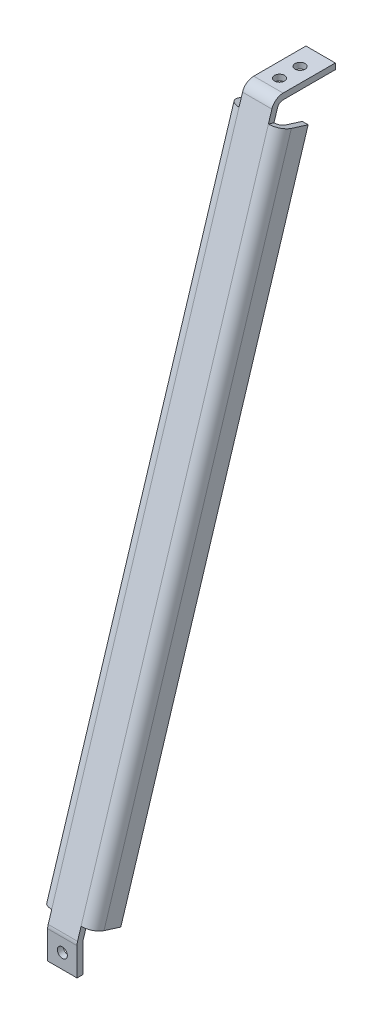
ISO-10303-21;
HEADER;
FILE_DESCRIPTION(('STEP AP214'),'2;1');
FILE_NAME('part.step','',(''),(''),'','','');
FILE_SCHEMA(('AUTOMOTIVE_DESIGN { 1 0 10303 214 1 1 1 1 }'));
ENDSEC;
DATA;
#1=APPLICATION_CONTEXT('core data for automotive mechanical design processes');
#2=APPLICATION_PROTOCOL_DEFINITION('international standard','automotive_design',2000,#1);
#3=PRODUCT_CONTEXT('',#1,'mechanical');
#4=PRODUCT('Part','Part','',(#3));
#5=PRODUCT_RELATED_PRODUCT_CATEGORY('part','',(#4));
#6=PRODUCT_DEFINITION_FORMATION('','',#4);
#7=PRODUCT_DEFINITION_CONTEXT('part definition',#1,'design');
#8=PRODUCT_DEFINITION('design','',#6,#7);
#9=PRODUCT_DEFINITION_SHAPE('','',#8);
#10=(LENGTH_UNIT() NAMED_UNIT(*) SI_UNIT(.MILLI.,.METRE.));
#11=(NAMED_UNIT(*) PLANE_ANGLE_UNIT() SI_UNIT($,.RADIAN.));
#12=(NAMED_UNIT(*) SI_UNIT($,.STERADIAN.) SOLID_ANGLE_UNIT());
#13=UNCERTAINTY_MEASURE_WITH_UNIT(LENGTH_MEASURE(1.E-05),#10,'distance_accuracy_value','');
#14=(GEOMETRIC_REPRESENTATION_CONTEXT(3) GLOBAL_UNCERTAINTY_ASSIGNED_CONTEXT((#13)) GLOBAL_UNIT_ASSIGNED_CONTEXT((#10,
#11,#12)) REPRESENTATION_CONTEXT('',''));
#15=CARTESIAN_POINT('',(0.,0.,0.));
#16=DIRECTION('',(0.,0.,1.));
#17=DIRECTION('',(1.,0.,0.));
#18=AXIS2_PLACEMENT_3D('',#15,#16,#17);
#19=CARTESIAN_POINT('',(195.,-68.,39.7925903591226));
#20=DIRECTION('',(1.,0.,0.));
#21=DIRECTION('',(0.,0.,-1.));
#22=AXIS2_PLACEMENT_3D('',#19,#20,#21);
#23=PLANE('',#22);
#24=DIRECTION('',(0.,-0.954716716288455,0.297516372052681));
#25=VECTOR('',#24,1.);
#26=CARTESIAN_POINT('',(195.,-66.8099345117893,43.6114572242764));
#27=LINE('',#26,#25);
#28=CARTESIAN_POINT('',(195.,-66.8099345117893,43.6114572242764));
#29=VERTEX_POINT('',#28);
#30=CARTESIAN_POINT('',(195.,-70.6288013769431,44.8015227124871));
#31=VERTEX_POINT('',#30);
#32=EDGE_CURVE('E283',#29,#31,#27,.T.);
#33=ORIENTED_EDGE('',*,*,#32,.T.);
#34=DIRECTION('',(0.,-0.297516372052681,-0.954716716288455));
#35=VECTOR('',#34,1.);
#36=CARTESIAN_POINT('',(195.,-71.8188668651538,40.9826558473333));
#37=LINE('',#36,#35);
#38=CARTESIAN_POINT('',(195.,-71.2238341210484,42.8920892799102));
#39=VERTEX_POINT('',#38);
#40=EDGE_CURVE('E49',#31,#39,#37,.T.);
#41=ORIENTED_EDGE('',*,*,#40,.T.);
#42=DIRECTION('',(0.,0.954716716288455,-0.297516372052681));
#43=VECTOR('',#42,1.);
#44=CARTESIAN_POINT('',(195.,-279.861580282591,107.909433432577));
#45=LINE('',#44,#43);
#46=CARTESIAN_POINT('',(195.,-67.4049672558946,41.7020237916995));
#47=VERTEX_POINT('',#46);
#48=EDGE_CURVE('E297',#39,#47,#45,.T.);
#49=ORIENTED_EDGE('',*,*,#48,.T.);
#50=CARTESIAN_POINT('',(195.,-68.,39.7925903591226));
#51=DIRECTION('',(-1.,0.,0.));
#52=DIRECTION('',(0.,0.,-1.));
#53=AXIS2_PLACEMENT_3D('',#50,#51,#52);
#54=CIRCLE('',#53,2.);
#55=CARTESIAN_POINT('',(195.,-66.,39.7925903591226));
#56=VERTEX_POINT('',#55);
#57=EDGE_CURVE('E301',#47,#56,#54,.T.);
#58=ORIENTED_EDGE('',*,*,#57,.T.);
#59=DIRECTION('',(0.,0.,-1.));
#60=VECTOR('',#59,1.);
#61=CARTESIAN_POINT('',(195.,-66.,39.7925903591226));
#62=LINE('',#61,#60);
#63=CARTESIAN_POINT('',(195.,-66.,22.));
#64=VERTEX_POINT('',#63);
#65=EDGE_CURVE('E304',#56,#64,#62,.T.);
#66=ORIENTED_EDGE('',*,*,#65,.T.);
#67=DIRECTION('',(0.,1.,0.));
#68=VECTOR('',#67,1.);
#69=CARTESIAN_POINT('',(195.,-66.,22.));
#70=LINE('',#69,#68);
#71=CARTESIAN_POINT('',(195.,-64.,22.));
#72=VERTEX_POINT('',#71);
#73=EDGE_CURVE('E274',#64,#72,#70,.T.);
#74=ORIENTED_EDGE('',*,*,#73,.T.);
#75=DIRECTION('',(0.,0.,1.));
#76=VECTOR('',#75,1.);
#77=CARTESIAN_POINT('',(195.,-64.,22.));
#78=LINE('',#77,#76);
#79=CARTESIAN_POINT('',(195.,-64.,39.7925903591226));
#80=VERTEX_POINT('',#79);
#81=EDGE_CURVE('E279',#72,#80,#78,.T.);
#82=ORIENTED_EDGE('',*,*,#81,.T.);
#83=CARTESIAN_POINT('',(195.,-68.,39.7925903591226));
#84=DIRECTION('',(1.,0.,0.));
#85=DIRECTION('',(0.,0.,-1.));
#86=AXIS2_PLACEMENT_3D('',#83,#84,#85);
#87=CIRCLE('',#86,4.);
#88=EDGE_CURVE('E281',#80,#29,#87,.T.);
#89=ORIENTED_EDGE('',*,*,#88,.T.);
#90=EDGE_LOOP('',(#33,#41,#49,#58,#66,#74,#82,#89));
#91=FACE_BOUND('',#90,.T.);
#92=ADVANCED_FACE('F41',(#91),#23,.T.);
#93=CARTESIAN_POINT('',(185.,-68.,39.7925903591226));
#94=DIRECTION('',(1.,0.,0.));
#95=DIRECTION('',(0.,0.,-1.));
#96=AXIS2_PLACEMENT_3D('',#93,#94,#95);
#97=PLANE('',#96);
#98=DIRECTION('',(0.,-0.297516372052681,-0.954716716288455));
#99=VECTOR('',#98,1.);
#100=CARTESIAN_POINT('',(185.,-71.8188668651538,40.9826558473333));
#101=LINE('',#100,#99);
#102=CARTESIAN_POINT('',(185.,-70.6288013769431,44.8015227124871));
#103=VERTEX_POINT('',#102);
#104=CARTESIAN_POINT('',(185.,-71.2238341210485,42.8920892799102));
#105=VERTEX_POINT('',#104);
#106=EDGE_CURVE('E365',#103,#105,#101,.T.);
#107=ORIENTED_EDGE('',*,*,#106,.F.);
#108=DIRECTION('',(0.,-0.954716716288455,0.297516372052681));
#109=VECTOR('',#108,1.);
#110=CARTESIAN_POINT('',(185.,-66.8099345117893,43.6114572242764));
#111=LINE('',#110,#109);
#112=CARTESIAN_POINT('',(185.,-66.8099345117893,43.6114572242764));
#113=VERTEX_POINT('',#112);
#114=EDGE_CURVE('E310',#113,#103,#111,.T.);
#115=ORIENTED_EDGE('',*,*,#114,.F.);
#116=CARTESIAN_POINT('',(185.,-68.,39.7925903591226));
#117=DIRECTION('',(1.,0.,0.));
#118=DIRECTION('',(0.,0.,-1.));
#119=AXIS2_PLACEMENT_3D('',#116,#117,#118);
#120=CIRCLE('',#119,4.);
#121=CARTESIAN_POINT('',(185.,-64.,39.7925903591226));
#122=VERTEX_POINT('',#121);
#123=EDGE_CURVE('E307',#122,#113,#120,.T.);
#124=ORIENTED_EDGE('',*,*,#123,.F.);
#125=DIRECTION('',(0.,0.,1.));
#126=VECTOR('',#125,1.);
#127=CARTESIAN_POINT('',(185.,-64.,22.));
#128=LINE('',#127,#126);
#129=CARTESIAN_POINT('',(185.,-64.,22.));
#130=VERTEX_POINT('',#129);
#131=EDGE_CURVE('E231',#130,#122,#128,.T.);
#132=ORIENTED_EDGE('',*,*,#131,.F.);
#133=DIRECTION('',(0.,1.,0.));
#134=VECTOR('',#133,1.);
#135=CARTESIAN_POINT('',(185.,-66.,22.));
#136=LINE('',#135,#134);
#137=CARTESIAN_POINT('',(185.,-66.,22.));
#138=VERTEX_POINT('',#137);
#139=EDGE_CURVE('E229',#138,#130,#136,.T.);
#140=ORIENTED_EDGE('',*,*,#139,.F.);
#141=DIRECTION('',(0.,0.,-1.));
#142=VECTOR('',#141,1.);
#143=CARTESIAN_POINT('',(185.,-66.,39.7925903591226));
#144=LINE('',#143,#142);
#145=CARTESIAN_POINT('',(185.,-66.,39.7925903591226));
#146=VERTEX_POINT('',#145);
#147=EDGE_CURVE('E276',#146,#138,#144,.T.);
#148=ORIENTED_EDGE('',*,*,#147,.F.);
#149=CARTESIAN_POINT('',(185.,-68.,39.7925903591226));
#150=DIRECTION('',(-1.,0.,0.));
#151=DIRECTION('',(0.,0.,-1.));
#152=AXIS2_PLACEMENT_3D('',#149,#150,#151);
#153=CIRCLE('',#152,2.);
#154=CARTESIAN_POINT('',(185.,-67.4049672558946,41.7020237916995));
#155=VERTEX_POINT('',#154);
#156=EDGE_CURVE('E326',#155,#146,#153,.T.);
#157=ORIENTED_EDGE('',*,*,#156,.F.);
#158=DIRECTION('',(0.,0.954716716288455,-0.297516372052681));
#159=VECTOR('',#158,1.);
#160=CARTESIAN_POINT('',(185.,-279.861580282591,107.909433432577));
#161=LINE('',#160,#159);
#162=EDGE_CURVE('E325',#105,#155,#161,.T.);
#163=ORIENTED_EDGE('',*,*,#162,.F.);
#164=EDGE_LOOP('',(#107,#115,#124,#132,#140,#148,#157,#163));
#165=FACE_BOUND('',#164,.T.);
#166=ADVANCED_FACE('F435',(#165),#97,.F.);
#167=CARTESIAN_POINT('',(195.,-66.,22.));
#168=DIRECTION('',(0.,0.,1.));
#169=DIRECTION('',(1.,0.,0.));
#170=AXIS2_PLACEMENT_3D('',#167,#168,#169);
#171=PLANE('',#170);
#172=ORIENTED_EDGE('',*,*,#139,.T.);
#173=DIRECTION('',(-1.,0.,0.));
#174=VECTOR('',#173,1.);
#175=CARTESIAN_POINT('',(195.,-64.,22.));
#176=LINE('',#175,#174);
#177=EDGE_CURVE('E363',#72,#130,#176,.T.);
#178=ORIENTED_EDGE('',*,*,#177,.F.);
#179=ORIENTED_EDGE('',*,*,#73,.F.);
#180=DIRECTION('',(-1.,0.,0.));
#181=VECTOR('',#180,1.);
#182=CARTESIAN_POINT('',(195.,-66.,22.));
#183=LINE('',#182,#181);
#184=EDGE_CURVE('E303',#64,#138,#183,.T.);
#185=ORIENTED_EDGE('',*,*,#184,.T.);
#186=EDGE_LOOP('',(#172,#178,#179,#185));
#187=FACE_BOUND('',#186,.T.);
#188=ADVANCED_FACE('F43',(#187),#171,.F.);
#189=CARTESIAN_POINT('',(195.,-64.,22.));
#190=DIRECTION('',(0.,-1.,0.));
#191=DIRECTION('',(0.,0.,-1.));
#192=AXIS2_PLACEMENT_3D('',#189,#190,#191);
#193=PLANE('',#192);
#194=CARTESIAN_POINT('',(190.,-64.,29.));
#195=DIRECTION('',(0.,-1.,0.));
#196=DIRECTION('',(0.,0.,-1.));
#197=AXIS2_PLACEMENT_3D('',#194,#195,#196);
#198=CIRCLE('',#197,1.70000000000001);
#199=CARTESIAN_POINT('',(190.,-64.,27.3));
#200=VERTEX_POINT('',#199);
#201=EDGE_CURVE('E241',#200,#200,#198,.F.);
#202=ORIENTED_EDGE('',*,*,#201,.F.);
#203=EDGE_LOOP('',(#202));
#204=FACE_BOUND('',#203,.T.);
#205=CARTESIAN_POINT('',(190.,-64.,36.));
#206=DIRECTION('',(0.,-1.,0.));
#207=DIRECTION('',(0.,0.,-1.));
#208=AXIS2_PLACEMENT_3D('',#205,#206,#207);
#209=CIRCLE('',#208,1.70000000000001);
#210=CARTESIAN_POINT('',(190.,-64.,34.3));
#211=VERTEX_POINT('',#210);
#212=EDGE_CURVE('E375',#211,#211,#209,.F.);
#213=ORIENTED_EDGE('',*,*,#212,.F.);
#214=EDGE_LOOP('',(#213));
#215=FACE_BOUND('',#214,.T.);
#216=ORIENTED_EDGE('',*,*,#131,.T.);
#217=DIRECTION('',(-1.,0.,0.));
#218=VECTOR('',#217,1.);
#219=CARTESIAN_POINT('',(195.,-64.,39.7925903591226));
#220=LINE('',#219,#218);
#221=EDGE_CURVE('E359',#80,#122,#220,.T.);
#222=ORIENTED_EDGE('',*,*,#221,.F.);
#223=ORIENTED_EDGE('',*,*,#81,.F.);
#224=ORIENTED_EDGE('',*,*,#177,.T.);
#225=EDGE_LOOP('',(#216,#222,#223,#224));
#226=FACE_BOUND('',#225,.T.);
#227=ADVANCED_FACE('F741',(#204,#215,#226),#193,.F.);
#228=CARTESIAN_POINT('',(195.,-68.,39.7925903591226));
#229=DIRECTION('',(-1.,0.,0.));
#230=DIRECTION('',(0.,0.,1.));
#231=AXIS2_PLACEMENT_3D('',#228,#229,#230);
#232=CYLINDRICAL_SURFACE('',#231,4.);
#233=ORIENTED_EDGE('',*,*,#123,.T.);
#234=DIRECTION('',(-1.,0.,0.));
#235=VECTOR('',#234,1.);
#236=CARTESIAN_POINT('',(195.,-66.8099345117893,43.6114572242764));
#237=LINE('',#236,#235);
#238=EDGE_CURVE('E355',#29,#113,#237,.T.);
#239=ORIENTED_EDGE('',*,*,#238,.F.);
#240=ORIENTED_EDGE('',*,*,#88,.F.);
#241=ORIENTED_EDGE('',*,*,#221,.T.);
#242=EDGE_LOOP('',(#233,#239,#240,#241));
#243=FACE_BOUND('',#242,.T.);
#244=ADVANCED_FACE('F732',(#243),#232,.T.);
#245=CARTESIAN_POINT('',(195.,-66.8099345117893,43.6114572242764));
#246=DIRECTION('',(0.,-0.297516372052681,-0.954716716288455));
#247=DIRECTION('',(0.,0.954716716288455,-0.297516372052681));
#248=AXIS2_PLACEMENT_3D('',#245,#246,#247);
#249=PLANE('',#248);
#250=ORIENTED_EDGE('',*,*,#114,.T.);
#251=DIRECTION('',(0.,0.954716716288455,-0.297516372052681));
#252=VECTOR('',#251,1.);
#253=CARTESIAN_POINT('',(185.,-275.447680673332,108.628801376943));
#254=LINE('',#253,#252);
#255=CARTESIAN_POINT('',(185.,-275.447680673332,108.628801376943));
#256=VERTEX_POINT('',#255);
#257=EDGE_CURVE('E391',#256,#103,#254,.T.);
#258=ORIENTED_EDGE('',*,*,#257,.F.);
#259=CARTESIAN_POINT('',(185.,-279.266547538485,109.818866865154));
#260=VERTEX_POINT('',#259);
#261=EDGE_CURVE('E66',#256,#260,#111,.T.);
#262=ORIENTED_EDGE('',*,*,#261,.T.);
#263=DIRECTION('',(-1.,0.,0.));
#264=VECTOR('',#263,1.);
#265=CARTESIAN_POINT('',(195.,-279.266547538485,109.818866865154));
#266=LINE('',#265,#264);
#267=CARTESIAN_POINT('',(195.,-279.266547538485,109.818866865154));
#268=VERTEX_POINT('',#267);
#269=EDGE_CURVE('E352',#268,#260,#266,.T.);
#270=ORIENTED_EDGE('',*,*,#269,.F.);
#271=CARTESIAN_POINT('',(195.,-275.447680673332,108.628801376943));
#272=VERTEX_POINT('',#271);
#273=EDGE_CURVE('E284',#272,#268,#27,.T.);
#274=ORIENTED_EDGE('',*,*,#273,.F.);
#275=DIRECTION('',(0.,0.954716716288455,-0.297516372052681));
#276=VECTOR('',#275,1.);
#277=CARTESIAN_POINT('',(195.,-275.447680673332,108.628801376943));
#278=LINE('',#277,#276);
#279=EDGE_CURVE('E240',#272,#31,#278,.T.);
#280=ORIENTED_EDGE('',*,*,#279,.T.);
#281=ORIENTED_EDGE('',*,*,#32,.F.);
#282=ORIENTED_EDGE('',*,*,#238,.T.);
#283=EDGE_LOOP('',(#250,#258,#262,#270,#274,#280,#281,#282));
#284=FACE_BOUND('',#283,.T.);
#285=ADVANCED_FACE('F462',(#284),#249,.F.);
#286=CARTESIAN_POINT('',(195.,-280.456613026696,106.));
#287=DIRECTION('',(-1.,0.,0.));
#288=DIRECTION('',(0.,0.,1.));
#289=AXIS2_PLACEMENT_3D('',#286,#287,#288);
#290=CYLINDRICAL_SURFACE('',#289,4.);
#291=CARTESIAN_POINT('',(185.,-280.456613026696,106.));
#292=DIRECTION('',(1.,0.,0.));
#293=DIRECTION('',(0.,0.,-1.));
#294=AXIS2_PLACEMENT_3D('',#291,#292,#293);
#295=CIRCLE('',#294,4.);
#296=CARTESIAN_POINT('',(185.,-280.456613026696,110.));
#297=VERTEX_POINT('',#296);
#298=EDGE_CURVE('E315',#260,#297,#295,.T.);
#299=ORIENTED_EDGE('',*,*,#298,.T.);
#300=DIRECTION('',(-1.,0.,0.));
#301=VECTOR('',#300,1.);
#302=CARTESIAN_POINT('',(195.,-280.456613026696,110.));
#303=LINE('',#302,#301);
#304=CARTESIAN_POINT('',(195.,-280.456613026696,110.));
#305=VERTEX_POINT('',#304);
#306=EDGE_CURVE('E349',#305,#297,#303,.T.);
#307=ORIENTED_EDGE('',*,*,#306,.F.);
#308=CARTESIAN_POINT('',(195.,-280.456613026696,106.));
#309=DIRECTION('',(1.,0.,0.));
#310=DIRECTION('',(0.,0.,-1.));
#311=AXIS2_PLACEMENT_3D('',#308,#309,#310);
#312=CIRCLE('',#311,4.);
#313=EDGE_CURVE('E287',#268,#305,#312,.T.);
#314=ORIENTED_EDGE('',*,*,#313,.F.);
#315=ORIENTED_EDGE('',*,*,#269,.T.);
#316=EDGE_LOOP('',(#299,#307,#314,#315));
#317=FACE_BOUND('',#316,.T.);
#318=ADVANCED_FACE('F469',(#317),#290,.T.);
#319=CARTESIAN_POINT('',(195.,-280.456613026696,110.));
#320=DIRECTION('',(0.,0.,-1.));
#321=DIRECTION('',(-1.,0.,0.));
#322=AXIS2_PLACEMENT_3D('',#319,#320,#321);
#323=PLANE('',#322);
#324=CARTESIAN_POINT('',(190.,-285.,110.));
#325=DIRECTION('',(0.,0.,-1.));
#326=DIRECTION('',(-1.,0.,0.));
#327=AXIS2_PLACEMENT_3D('',#324,#325,#326);
#328=CIRCLE('',#327,1.70000000000001);
#329=CARTESIAN_POINT('',(188.3,-285.,110.));
#330=VERTEX_POINT('',#329);
#331=EDGE_CURVE('E373',#330,#330,#328,.F.);
#332=ORIENTED_EDGE('',*,*,#331,.F.);
#333=EDGE_LOOP('',(#332));
#334=FACE_BOUND('',#333,.T.);
#335=DIRECTION('',(0.,-1.,0.));
#336=VECTOR('',#335,1.);
#337=CARTESIAN_POINT('',(185.,-280.456613026696,110.));
#338=LINE('',#337,#336);
#339=CARTESIAN_POINT('',(185.,-290.,110.));
#340=VERTEX_POINT('',#339);
#341=EDGE_CURVE('E314',#297,#340,#338,.T.);
#342=ORIENTED_EDGE('',*,*,#341,.T.);
#343=DIRECTION('',(-1.,0.,0.));
#344=VECTOR('',#343,1.);
#345=CARTESIAN_POINT('',(195.,-290.,110.));
#346=LINE('',#345,#344);
#347=CARTESIAN_POINT('',(195.,-290.,110.));
#348=VERTEX_POINT('',#347);
#349=EDGE_CURVE('E347',#348,#340,#346,.T.);
#350=ORIENTED_EDGE('',*,*,#349,.F.);
#351=DIRECTION('',(0.,-1.,0.));
#352=VECTOR('',#351,1.);
#353=CARTESIAN_POINT('',(195.,-280.456613026696,110.));
#354=LINE('',#353,#352);
#355=EDGE_CURVE('E288',#305,#348,#354,.T.);
#356=ORIENTED_EDGE('',*,*,#355,.F.);
#357=ORIENTED_EDGE('',*,*,#306,.T.);
#358=EDGE_LOOP('',(#342,#350,#356,#357));
#359=FACE_BOUND('',#358,.T.);
#360=ADVANCED_FACE('F475',(#334,#359),#323,.F.);
#361=CARTESIAN_POINT('',(195.,-290.,110.));
#362=DIRECTION('',(0.,1.,0.));
#363=DIRECTION('',(0.,0.,1.));
#364=AXIS2_PLACEMENT_3D('',#361,#362,#363);
#365=PLANE('',#364);
#366=DIRECTION('',(0.,0.,-1.));
#367=VECTOR('',#366,1.);
#368=CARTESIAN_POINT('',(185.,-290.,110.));
#369=LINE('',#368,#367);
#370=CARTESIAN_POINT('',(185.,-290.,108.));
#371=VERTEX_POINT('',#370);
#372=EDGE_CURVE('E316',#340,#371,#369,.T.);
#373=ORIENTED_EDGE('',*,*,#372,.T.);
#374=DIRECTION('',(-1.,0.,0.));
#375=VECTOR('',#374,1.);
#376=CARTESIAN_POINT('',(195.,-290.,108.));
#377=LINE('',#376,#375);
#378=CARTESIAN_POINT('',(195.,-290.,108.));
#379=VERTEX_POINT('',#378);
#380=EDGE_CURVE('E344',#379,#371,#377,.T.);
#381=ORIENTED_EDGE('',*,*,#380,.F.);
#382=DIRECTION('',(0.,0.,-1.));
#383=VECTOR('',#382,1.);
#384=CARTESIAN_POINT('',(195.,-290.,110.));
#385=LINE('',#384,#383);
#386=EDGE_CURVE('E292',#348,#379,#385,.T.);
#387=ORIENTED_EDGE('',*,*,#386,.F.);
#388=ORIENTED_EDGE('',*,*,#349,.T.);
#389=EDGE_LOOP('',(#373,#381,#387,#388));
#390=FACE_BOUND('',#389,.T.);
#391=ADVANCED_FACE('F476',(#390),#365,.F.);
#392=CARTESIAN_POINT('',(195.,-290.,108.));
#393=DIRECTION('',(0.,0.,1.));
#394=DIRECTION('',(1.,0.,0.));
#395=AXIS2_PLACEMENT_3D('',#392,#393,#394);
#396=PLANE('',#395);
#397=CARTESIAN_POINT('',(190.,-285.,108.));
#398=DIRECTION('',(0.,0.,1.));
#399=DIRECTION('',(1.,0.,0.));
#400=AXIS2_PLACEMENT_3D('',#397,#398,#399);
#401=CIRCLE('',#400,1.70000000000001);
#402=CARTESIAN_POINT('',(191.7,-285.,108.));
#403=VERTEX_POINT('',#402);
#404=EDGE_CURVE('E44',#403,#403,#401,.F.);
#405=ORIENTED_EDGE('',*,*,#404,.F.);
#406=EDGE_LOOP('',(#405));
#407=FACE_BOUND('',#406,.T.);
#408=DIRECTION('',(0.,1.,0.));
#409=VECTOR('',#408,1.);
#410=CARTESIAN_POINT('',(185.,-290.,108.));
#411=LINE('',#410,#409);
#412=CARTESIAN_POINT('',(185.,-280.456613026696,108.));
#413=VERTEX_POINT('',#412);
#414=EDGE_CURVE('E318',#371,#413,#411,.T.);
#415=ORIENTED_EDGE('',*,*,#414,.T.);
#416=DIRECTION('',(-1.,0.,0.));
#417=VECTOR('',#416,1.);
#418=CARTESIAN_POINT('',(195.,-280.456613026696,108.));
#419=LINE('',#418,#417);
#420=CARTESIAN_POINT('',(195.,-280.456613026696,108.));
#421=VERTEX_POINT('',#420);
#422=EDGE_CURVE('E340',#421,#413,#419,.T.);
#423=ORIENTED_EDGE('',*,*,#422,.F.);
#424=DIRECTION('',(0.,1.,0.));
#425=VECTOR('',#424,1.);
#426=CARTESIAN_POINT('',(195.,-290.,108.));
#427=LINE('',#426,#425);
#428=EDGE_CURVE('E291',#379,#421,#427,.T.);
#429=ORIENTED_EDGE('',*,*,#428,.F.);
#430=ORIENTED_EDGE('',*,*,#380,.T.);
#431=EDGE_LOOP('',(#415,#423,#429,#430));
#432=FACE_BOUND('',#431,.T.);
#433=ADVANCED_FACE('F483',(#407,#432),#396,.F.);
#434=CARTESIAN_POINT('',(195.,-280.456613026696,106.));
#435=DIRECTION('',(-1.,0.,0.));
#436=DIRECTION('',(0.,0.,1.));
#437=AXIS2_PLACEMENT_3D('',#434,#435,#436);
#438=CYLINDRICAL_SURFACE('',#437,1.99999999999999);
#439=CARTESIAN_POINT('',(185.,-280.456613026696,106.));
#440=DIRECTION('',(-1.,0.,0.));
#441=DIRECTION('',(0.,0.,-1.));
#442=AXIS2_PLACEMENT_3D('',#439,#440,#441);
#443=CIRCLE('',#442,1.99999999999999);
#444=CARTESIAN_POINT('',(185.,-279.861580282591,107.909433432577));
#445=VERTEX_POINT('',#444);
#446=EDGE_CURVE('E319',#413,#445,#443,.T.);
#447=ORIENTED_EDGE('',*,*,#446,.T.);
#448=DIRECTION('',(-1.,0.,0.));
#449=VECTOR('',#448,1.);
#450=CARTESIAN_POINT('',(195.,-279.861580282591,107.909433432577));
#451=LINE('',#450,#449);
#452=CARTESIAN_POINT('',(195.,-279.861580282591,107.909433432577));
#453=VERTEX_POINT('',#452);
#454=EDGE_CURVE('E337',#453,#445,#451,.T.);
#455=ORIENTED_EDGE('',*,*,#454,.F.);
#456=CARTESIAN_POINT('',(195.,-280.456613026696,106.));
#457=DIRECTION('',(-1.,0.,0.));
#458=DIRECTION('',(0.,0.,-1.));
#459=AXIS2_PLACEMENT_3D('',#456,#457,#458);
#460=CIRCLE('',#459,1.99999999999999);
#461=EDGE_CURVE('E293',#421,#453,#460,.T.);
#462=ORIENTED_EDGE('',*,*,#461,.F.);
#463=ORIENTED_EDGE('',*,*,#422,.T.);
#464=EDGE_LOOP('',(#447,#455,#462,#463));
#465=FACE_BOUND('',#464,.T.);
#466=ADVANCED_FACE('F490',(#465),#438,.F.);
#467=CARTESIAN_POINT('',(195.,-279.861580282591,107.909433432577));
#468=DIRECTION('',(0.,0.297516372052681,0.954716716288455));
#469=DIRECTION('',(0.,-0.954716716288455,0.297516372052681));
#470=AXIS2_PLACEMENT_3D('',#467,#468,#469);
#471=PLANE('',#470);
#472=DIRECTION('',(0.,0.954716716288455,-0.297516372052681));
#473=VECTOR('',#472,1.);
#474=CARTESIAN_POINT('',(195.,-276.042713417437,106.719367944366));
#475=LINE('',#474,#473);
#476=CARTESIAN_POINT('',(195.,-276.042713417437,106.719367944366));
#477=VERTEX_POINT('',#476);
#478=EDGE_CURVE('E238',#477,#39,#475,.T.);
#479=ORIENTED_EDGE('',*,*,#478,.F.);
#480=EDGE_CURVE('E299',#453,#477,#45,.T.);
#481=ORIENTED_EDGE('',*,*,#480,.F.);
#482=ORIENTED_EDGE('',*,*,#454,.T.);
#483=CARTESIAN_POINT('',(185.,-276.042713417437,106.719367944366));
#484=VERTEX_POINT('',#483);
#485=EDGE_CURVE('E323',#445,#484,#161,.T.);
#486=ORIENTED_EDGE('',*,*,#485,.T.);
#487=DIRECTION('',(0.,0.954716716288455,-0.297516372052681));
#488=VECTOR('',#487,1.);
#489=CARTESIAN_POINT('',(185.,-276.042713417437,106.719367944366));
#490=LINE('',#489,#488);
#491=EDGE_CURVE('E405',#484,#105,#490,.T.);
#492=ORIENTED_EDGE('',*,*,#491,.T.);
#493=ORIENTED_EDGE('',*,*,#162,.T.);
#494=DIRECTION('',(-1.,0.,0.));
#495=VECTOR('',#494,1.);
#496=CARTESIAN_POINT('',(195.,-67.4049672558946,41.7020237916995));
#497=LINE('',#496,#495);
#498=EDGE_CURVE('E331',#47,#155,#497,.T.);
#499=ORIENTED_EDGE('',*,*,#498,.F.);
#500=ORIENTED_EDGE('',*,*,#48,.F.);
#501=EDGE_LOOP('',(#479,#481,#482,#486,#492,#493,#499,#500));
#502=FACE_BOUND('',#501,.T.);
#503=ADVANCED_FACE('F495',(#502),#471,.F.);
#504=CARTESIAN_POINT('',(195.,-68.,39.7925903591226));
#505=DIRECTION('',(-1.,0.,0.));
#506=DIRECTION('',(0.,0.,1.));
#507=AXIS2_PLACEMENT_3D('',#504,#505,#506);
#508=CYLINDRICAL_SURFACE('',#507,2.);
#509=ORIENTED_EDGE('',*,*,#156,.T.);
#510=DIRECTION('',(-1.,0.,0.));
#511=VECTOR('',#510,1.);
#512=CARTESIAN_POINT('',(195.,-66.,39.7925903591226));
#513=LINE('',#512,#511);
#514=EDGE_CURVE('E332',#56,#146,#513,.T.);
#515=ORIENTED_EDGE('',*,*,#514,.F.);
#516=ORIENTED_EDGE('',*,*,#57,.F.);
#517=ORIENTED_EDGE('',*,*,#498,.T.);
#518=EDGE_LOOP('',(#509,#515,#516,#517));
#519=FACE_BOUND('',#518,.T.);
#520=ADVANCED_FACE('F452',(#519),#508,.F.);
#521=CARTESIAN_POINT('',(195.,-66.,39.7925903591226));
#522=DIRECTION('',(0.,1.,0.));
#523=DIRECTION('',(0.,0.,1.));
#524=AXIS2_PLACEMENT_3D('',#521,#522,#523);
#525=PLANE('',#524);
#526=CARTESIAN_POINT('',(190.,-66.,29.));
#527=DIRECTION('',(0.,1.,0.));
#528=DIRECTION('',(0.,0.,1.));
#529=AXIS2_PLACEMENT_3D('',#526,#527,#528);
#530=CIRCLE('',#529,1.70000000000001);
#531=CARTESIAN_POINT('',(190.,-66.,30.7));
#532=VERTEX_POINT('',#531);
#533=EDGE_CURVE('E372',#532,#532,#530,.F.);
#534=ORIENTED_EDGE('',*,*,#533,.F.);
#535=EDGE_LOOP('',(#534));
#536=FACE_BOUND('',#535,.T.);
#537=CARTESIAN_POINT('',(190.,-66.,36.));
#538=DIRECTION('',(0.,1.,0.));
#539=DIRECTION('',(0.,0.,1.));
#540=AXIS2_PLACEMENT_3D('',#537,#538,#539);
#541=CIRCLE('',#540,1.70000000000001);
#542=CARTESIAN_POINT('',(190.,-66.,37.7));
#543=VERTEX_POINT('',#542);
#544=EDGE_CURVE('E367',#543,#543,#541,.F.);
#545=ORIENTED_EDGE('',*,*,#544,.F.);
#546=EDGE_LOOP('',(#545));
#547=FACE_BOUND('',#546,.T.);
#548=ORIENTED_EDGE('',*,*,#147,.T.);
#549=ORIENTED_EDGE('',*,*,#184,.F.);
#550=ORIENTED_EDGE('',*,*,#65,.F.);
#551=ORIENTED_EDGE('',*,*,#514,.T.);
#552=EDGE_LOOP('',(#548,#549,#550,#551));
#553=FACE_BOUND('',#552,.T.);
#554=ADVANCED_FACE('F443',(#536,#547,#553),#525,.F.);
#555=DIRECTION('',(0.,-0.297516372052681,-0.954716716288455));
#556=VECTOR('',#555,1.);
#557=CARTESIAN_POINT('',(195.,-276.637746161542,104.809934511789));
#558=LINE('',#557,#556);
#559=EDGE_CURVE('E11',#272,#477,#558,.T.);
#560=ORIENTED_EDGE('',*,*,#559,.F.);
#561=ORIENTED_EDGE('',*,*,#273,.T.);
#562=ORIENTED_EDGE('',*,*,#313,.T.);
#563=ORIENTED_EDGE('',*,*,#355,.T.);
#564=ORIENTED_EDGE('',*,*,#386,.T.);
#565=ORIENTED_EDGE('',*,*,#428,.T.);
#566=ORIENTED_EDGE('',*,*,#461,.T.);
#567=ORIENTED_EDGE('',*,*,#480,.T.);
#568=EDGE_LOOP('',(#560,#561,#562,#563,#564,#565,#566,#567));
#569=FACE_BOUND('',#568,.T.);
#570=ADVANCED_FACE('F434',(#569),#23,.T.);
#571=ORIENTED_EDGE('',*,*,#261,.F.);
#572=DIRECTION('',(0.,-0.297516372052681,-0.954716716288455));
#573=VECTOR('',#572,1.);
#574=CARTESIAN_POINT('',(185.,-276.637746161542,104.809934511789));
#575=LINE('',#574,#573);
#576=EDGE_CURVE('E219',#256,#484,#575,.T.);
#577=ORIENTED_EDGE('',*,*,#576,.T.);
#578=ORIENTED_EDGE('',*,*,#485,.F.);
#579=ORIENTED_EDGE('',*,*,#446,.F.);
#580=ORIENTED_EDGE('',*,*,#414,.F.);
#581=ORIENTED_EDGE('',*,*,#372,.F.);
#582=ORIENTED_EDGE('',*,*,#341,.F.);
#583=ORIENTED_EDGE('',*,*,#298,.F.);
#584=EDGE_LOOP('',(#571,#577,#578,#579,#580,#581,#582,#583));
#585=FACE_BOUND('',#584,.T.);
#586=ADVANCED_FACE('F445',(#585),#97,.F.);
#587=CARTESIAN_POINT('',(185.,-276.637746161542,104.809934511789));
#588=DIRECTION('',(0.,-0.954716716288455,0.297516372052681));
#589=DIRECTION('',(0.,-0.297516372052681,-0.954716716288455));
#590=AXIS2_PLACEMENT_3D('',#587,#588,#589);
#591=PLANE('',#590);
#592=ORIENTED_EDGE('',*,*,#576,.F.);
#593=CARTESIAN_POINT('',(185.,-276.637746161542,104.809934511789));
#594=DIRECTION('',(0.,-0.954716716288455,0.297516372052681));
#595=DIRECTION('',(0.,-0.297516372052681,-0.954716716288455));
#596=AXIS2_PLACEMENT_3D('',#593,#594,#595);
#597=CIRCLE('',#596,4.);
#598=CARTESIAN_POINT('',(181.,-276.637746161542,104.809934511789));
#599=VERTEX_POINT('',#598);
#600=EDGE_CURVE('E212',#256,#599,#597,.T.);
#601=ORIENTED_EDGE('',*,*,#600,.T.);
#602=DIRECTION('',(0.,-0.29751637205268,-0.954716716288456));
#603=VECTOR('',#602,1.);
#604=CARTESIAN_POINT('',(181.,-276.637746161542,104.809934511789));
#605=LINE('',#604,#603);
#606=CARTESIAN_POINT('',(181.,-278.422844393858,99.0816342140585));
#607=VERTEX_POINT('',#606);
#608=EDGE_CURVE('E201',#599,#607,#605,.T.);
#609=ORIENTED_EDGE('',*,*,#608,.T.);
#610=DIRECTION('',(1.,0.,0.));
#611=VECTOR('',#610,1.);
#612=CARTESIAN_POINT('',(181.,-278.422844393858,99.0816342140585));
#613=LINE('',#612,#611);
#614=CARTESIAN_POINT('',(183.,-278.422844393858,99.0816342140585));
#615=VERTEX_POINT('',#614);
#616=EDGE_CURVE('E213',#607,#615,#613,.T.);
#617=ORIENTED_EDGE('',*,*,#616,.T.);
#618=DIRECTION('',(0.,0.29751637205268,0.954716716288456));
#619=VECTOR('',#618,1.);
#620=CARTESIAN_POINT('',(183.,-278.422844393858,99.0816342140585));
#621=LINE('',#620,#619);
#622=CARTESIAN_POINT('',(183.,-276.637746161542,104.809934511789));
#623=VERTEX_POINT('',#622);
#624=EDGE_CURVE('E390',#615,#623,#621,.T.);
#625=ORIENTED_EDGE('',*,*,#624,.T.);
#626=CARTESIAN_POINT('',(185.,-276.637746161542,104.809934511789));
#627=DIRECTION('',(0.,0.954716716288455,-0.297516372052681));
#628=DIRECTION('',(0.,-0.297516372052681,-0.954716716288455));
#629=AXIS2_PLACEMENT_3D('',#626,#627,#628);
#630=CIRCLE('',#629,2.);
#631=EDGE_CURVE('E386',#623,#484,#630,.T.);
#632=ORIENTED_EDGE('',*,*,#631,.T.);
#633=EDGE_LOOP('',(#592,#601,#609,#617,#625,#632));
#634=FACE_BOUND('',#633,.T.);
#635=ADVANCED_FACE('F217',(#634),#591,.T.);
#636=CARTESIAN_POINT('',(185.,-71.8188668651538,40.9826558473333));
#637=DIRECTION('',(0.,-0.954716716288455,0.297516372052681));
#638=DIRECTION('',(0.,-0.297516372052681,-0.954716716288455));
#639=AXIS2_PLACEMENT_3D('',#636,#637,#638);
#640=PLANE('',#639);
#641=CARTESIAN_POINT('',(185.,-71.8188668651538,40.9826558473333));
#642=DIRECTION('',(0.,-0.954716716288455,0.297516372052681));
#643=DIRECTION('',(0.,-0.297516372052681,-0.954716716288455));
#644=AXIS2_PLACEMENT_3D('',#641,#642,#643);
#645=CIRCLE('',#644,4.);
#646=CARTESIAN_POINT('',(181.,-71.8188668651538,40.9826558473333));
#647=VERTEX_POINT('',#646);
#648=EDGE_CURVE('E227',#103,#647,#645,.T.);
#649=ORIENTED_EDGE('',*,*,#648,.F.);
#650=ORIENTED_EDGE('',*,*,#106,.T.);
#651=CARTESIAN_POINT('',(185.,-71.8188668651538,40.9826558473333));
#652=DIRECTION('',(0.,0.954716716288455,-0.297516372052681));
#653=DIRECTION('',(0.,-0.297516372052681,-0.954716716288455));
#654=AXIS2_PLACEMENT_3D('',#651,#652,#653);
#655=CIRCLE('',#654,2.);
#656=CARTESIAN_POINT('',(183.,-71.8188668651538,40.9826558473333));
#657=VERTEX_POINT('',#656);
#658=EDGE_CURVE('E224',#657,#105,#655,.T.);
#659=ORIENTED_EDGE('',*,*,#658,.F.);
#660=DIRECTION('',(0.,0.29751637205268,0.954716716288456));
#661=VECTOR('',#660,1.);
#662=CARTESIAN_POINT('',(183.,-73.6039650974699,35.2543555496026));
#663=LINE('',#662,#661);
#664=CARTESIAN_POINT('',(183.,-73.6039650974699,35.2543555496026));
#665=VERTEX_POINT('',#664);
#666=EDGE_CURVE('E397',#665,#657,#663,.T.);
#667=ORIENTED_EDGE('',*,*,#666,.F.);
#668=DIRECTION('',(1.,0.,0.));
#669=VECTOR('',#668,1.);
#670=CARTESIAN_POINT('',(181.,-73.6039650974699,35.2543555496026));
#671=LINE('',#670,#669);
#672=CARTESIAN_POINT('',(181.,-73.6039650974699,35.2543555496026));
#673=VERTEX_POINT('',#672);
#674=EDGE_CURVE('E395',#673,#665,#671,.T.);
#675=ORIENTED_EDGE('',*,*,#674,.F.);
#676=DIRECTION('',(0.,-0.29751637205268,-0.954716716288456));
#677=VECTOR('',#676,1.);
#678=CARTESIAN_POINT('',(181.,-71.8188668651538,40.9826558473333));
#679=LINE('',#678,#677);
#680=EDGE_CURVE('E394',#647,#673,#679,.T.);
#681=ORIENTED_EDGE('',*,*,#680,.F.);
#682=EDGE_LOOP('',(#649,#650,#659,#667,#675,#681));
#683=FACE_BOUND('',#682,.T.);
#684=ADVANCED_FACE('F417',(#683),#640,.F.);
#685=CARTESIAN_POINT('',(185.,-276.637746161542,104.809934511789));
#686=DIRECTION('',(0.,0.954716716288455,-0.297516372052681));
#687=DIRECTION('',(0.,0.297516372052681,0.954716716288455));
#688=AXIS2_PLACEMENT_3D('',#685,#686,#687);
#689=CYLINDRICAL_SURFACE('',#688,4.);
#690=ORIENTED_EDGE('',*,*,#648,.T.);
#691=DIRECTION('',(0.,0.954716716288455,-0.297516372052681));
#692=VECTOR('',#691,1.);
#693=CARTESIAN_POINT('',(181.,-276.637746161542,104.809934511789));
#694=LINE('',#693,#692);
#695=EDGE_CURVE('E210',#599,#647,#694,.T.);
#696=ORIENTED_EDGE('',*,*,#695,.F.);
#697=ORIENTED_EDGE('',*,*,#600,.F.);
#698=ORIENTED_EDGE('',*,*,#257,.T.);
#699=EDGE_LOOP('',(#690,#696,#697,#698));
#700=FACE_BOUND('',#699,.T.);
#701=ADVANCED_FACE('F223',(#700),#689,.T.);
#702=CARTESIAN_POINT('',(181.,-276.637746161542,104.809934511789));
#703=DIRECTION('',(1.,0.,0.));
#704=DIRECTION('',(0.,0.,-1.));
#705=AXIS2_PLACEMENT_3D('',#702,#703,#704);
#706=PLANE('',#705);
#707=ORIENTED_EDGE('',*,*,#680,.T.);
#708=DIRECTION('',(0.,0.954716716288455,-0.297516372052681));
#709=VECTOR('',#708,1.);
#710=CARTESIAN_POINT('',(181.,-278.422844393858,99.0816342140585));
#711=LINE('',#710,#709);
#712=EDGE_CURVE('E209',#607,#673,#711,.T.);
#713=ORIENTED_EDGE('',*,*,#712,.F.);
#714=ORIENTED_EDGE('',*,*,#608,.F.);
#715=ORIENTED_EDGE('',*,*,#695,.T.);
#716=EDGE_LOOP('',(#707,#713,#714,#715));
#717=FACE_BOUND('',#716,.T.);
#718=ADVANCED_FACE('F202',(#717),#706,.F.);
#719=CARTESIAN_POINT('',(181.,-278.422844393858,99.0816342140585));
#720=DIRECTION('',(0.,0.297516372052681,0.954716716288455));
#721=DIRECTION('',(0.,-0.954716716288455,0.297516372052681));
#722=AXIS2_PLACEMENT_3D('',#719,#720,#721);
#723=PLANE('',#722);
#724=ORIENTED_EDGE('',*,*,#674,.T.);
#725=DIRECTION('',(0.,0.954716716288455,-0.297516372052681));
#726=VECTOR('',#725,1.);
#727=CARTESIAN_POINT('',(183.,-278.422844393858,99.0816342140585));
#728=LINE('',#727,#726);
#729=EDGE_CURVE('E234',#615,#665,#728,.T.);
#730=ORIENTED_EDGE('',*,*,#729,.F.);
#731=ORIENTED_EDGE('',*,*,#616,.F.);
#732=ORIENTED_EDGE('',*,*,#712,.T.);
#733=EDGE_LOOP('',(#724,#730,#731,#732));
#734=FACE_BOUND('',#733,.T.);
#735=ADVANCED_FACE('F425',(#734),#723,.F.);
#736=CARTESIAN_POINT('',(183.,-278.422844393858,99.0816342140585));
#737=DIRECTION('',(-1.,0.,0.));
#738=DIRECTION('',(0.,0.,1.));
#739=AXIS2_PLACEMENT_3D('',#736,#737,#738);
#740=PLANE('',#739);
#741=ORIENTED_EDGE('',*,*,#666,.T.);
#742=DIRECTION('',(0.,0.954716716288455,-0.297516372052681));
#743=VECTOR('',#742,1.);
#744=CARTESIAN_POINT('',(183.,-276.637746161542,104.809934511789));
#745=LINE('',#744,#743);
#746=EDGE_CURVE('E404',#623,#657,#745,.T.);
#747=ORIENTED_EDGE('',*,*,#746,.F.);
#748=ORIENTED_EDGE('',*,*,#624,.F.);
#749=ORIENTED_EDGE('',*,*,#729,.T.);
#750=EDGE_LOOP('',(#741,#747,#748,#749));
#751=FACE_BOUND('',#750,.T.);
#752=ADVANCED_FACE('F411',(#751),#740,.F.);
#753=CARTESIAN_POINT('',(185.,-276.637746161542,104.809934511789));
#754=DIRECTION('',(0.,0.954716716288455,-0.297516372052681));
#755=DIRECTION('',(0.,0.297516372052681,0.954716716288455));
#756=AXIS2_PLACEMENT_3D('',#753,#754,#755);
#757=CYLINDRICAL_SURFACE('',#756,2.);
#758=ORIENTED_EDGE('',*,*,#658,.T.);
#759=ORIENTED_EDGE('',*,*,#491,.F.);
#760=ORIENTED_EDGE('',*,*,#631,.F.);
#761=ORIENTED_EDGE('',*,*,#746,.T.);
#762=EDGE_LOOP('',(#758,#759,#760,#761));
#763=FACE_BOUND('',#762,.T.);
#764=ADVANCED_FACE('F419',(#763),#757,.F.);
#765=CARTESIAN_POINT('',(195.,-276.637746161542,104.809934511789));
#766=DIRECTION('',(0.,0.954716716288455,-0.297516372052681));
#767=DIRECTION('',(0.,0.297516372052681,0.954716716288455));
#768=AXIS2_PLACEMENT_3D('',#765,#766,#767);
#769=CYLINDRICAL_SURFACE('',#768,4.);
#770=CARTESIAN_POINT('',(195.,-71.8188668651538,40.9826558473333));
#771=DIRECTION('',(0.,-0.954716716288455,0.297516372052681));
#772=DIRECTION('',(0.,-0.297516372052681,-0.954716716288455));
#773=AXIS2_PLACEMENT_3D('',#770,#771,#772);
#774=CIRCLE('',#773,4.);
#775=CARTESIAN_POINT('',(199.,-71.8188668651538,40.9826558473333));
#776=VERTEX_POINT('',#775);
#777=EDGE_CURVE('E262',#776,#31,#774,.T.);
#778=ORIENTED_EDGE('',*,*,#777,.T.);
#779=ORIENTED_EDGE('',*,*,#279,.F.);
#780=CARTESIAN_POINT('',(195.,-276.637746161542,104.809934511789));
#781=DIRECTION('',(0.,-0.954716716288455,0.297516372052681));
#782=DIRECTION('',(0.,-0.297516372052681,-0.954716716288455));
#783=AXIS2_PLACEMENT_3D('',#780,#781,#782);
#784=CIRCLE('',#783,4.);
#785=CARTESIAN_POINT('',(199.,-276.637746161542,104.809934511789));
#786=VERTEX_POINT('',#785);
#787=EDGE_CURVE('E259',#786,#272,#784,.T.);
#788=ORIENTED_EDGE('',*,*,#787,.F.);
#789=DIRECTION('',(0.,0.954716716288455,-0.297516372052681));
#790=VECTOR('',#789,1.);
#791=CARTESIAN_POINT('',(199.,-276.637746161542,104.809934511789));
#792=LINE('',#791,#790);
#793=EDGE_CURVE('E252',#786,#776,#792,.T.);
#794=ORIENTED_EDGE('',*,*,#793,.T.);
#795=EDGE_LOOP('',(#778,#779,#788,#794));
#796=FACE_BOUND('',#795,.T.);
#797=ADVANCED_FACE('F502',(#796),#769,.T.);
#798=CARTESIAN_POINT('',(195.,-276.637746161542,104.809934511789));
#799=DIRECTION('',(0.,0.954716716288455,-0.297516372052681));
#800=DIRECTION('',(0.,0.297516372052681,0.954716716288455));
#801=AXIS2_PLACEMENT_3D('',#798,#799,#800);
#802=CYLINDRICAL_SURFACE('',#801,2.);
#803=CARTESIAN_POINT('',(195.,-71.8188668651538,40.9826558473333));
#804=DIRECTION('',(0.,0.954716716288455,-0.297516372052681));
#805=DIRECTION('',(0.,-0.297516372052681,-0.954716716288455));
#806=AXIS2_PLACEMENT_3D('',#803,#804,#805);
#807=CIRCLE('',#806,2.);
#808=CARTESIAN_POINT('',(197.,-71.8188668651538,40.9826558473333));
#809=VERTEX_POINT('',#808);
#810=EDGE_CURVE('E59',#39,#809,#807,.T.);
#811=ORIENTED_EDGE('',*,*,#810,.T.);
#812=DIRECTION('',(0.,0.954716716288455,-0.297516372052681));
#813=VECTOR('',#812,1.);
#814=CARTESIAN_POINT('',(197.,-276.637746161542,104.809934511789));
#815=LINE('',#814,#813);
#816=CARTESIAN_POINT('',(197.,-276.637746161542,104.809934511789));
#817=VERTEX_POINT('',#816);
#818=EDGE_CURVE('E244',#817,#809,#815,.T.);
#819=ORIENTED_EDGE('',*,*,#818,.F.);
#820=CARTESIAN_POINT('',(195.,-276.637746161542,104.809934511789));
#821=DIRECTION('',(0.,0.954716716288455,-0.297516372052681));
#822=DIRECTION('',(0.,-0.297516372052681,-0.954716716288455));
#823=AXIS2_PLACEMENT_3D('',#820,#821,#822);
#824=CIRCLE('',#823,2.);
#825=EDGE_CURVE('E275',#477,#817,#824,.T.);
#826=ORIENTED_EDGE('',*,*,#825,.F.);
#827=ORIENTED_EDGE('',*,*,#478,.T.);
#828=EDGE_LOOP('',(#811,#819,#826,#827));
#829=FACE_BOUND('',#828,.T.);
#830=ADVANCED_FACE('F497',(#829),#802,.F.);
#831=CARTESIAN_POINT('',(197.,-278.422844393858,99.0816342140585));
#832=DIRECTION('',(1.,0.,0.));
#833=DIRECTION('',(0.,0.,-1.));
#834=AXIS2_PLACEMENT_3D('',#831,#832,#833);
#835=PLANE('',#834);
#836=DIRECTION('',(0.,-0.29751637205268,-0.954716716288456));
#837=VECTOR('',#836,1.);
#838=CARTESIAN_POINT('',(197.,-73.6039650974699,35.2543555496026));
#839=LINE('',#838,#837);
#840=CARTESIAN_POINT('',(197.,-73.6039650974699,35.2543555496026));
#841=VERTEX_POINT('',#840);
#842=EDGE_CURVE('E261',#809,#841,#839,.T.);
#843=ORIENTED_EDGE('',*,*,#842,.T.);
#844=DIRECTION('',(0.,0.954716716288455,-0.297516372052681));
#845=VECTOR('',#844,1.);
#846=CARTESIAN_POINT('',(197.,-278.422844393858,99.0816342140585));
#847=LINE('',#846,#845);
#848=CARTESIAN_POINT('',(197.,-278.422844393858,99.0816342140585));
#849=VERTEX_POINT('',#848);
#850=EDGE_CURVE('E246',#849,#841,#847,.T.);
#851=ORIENTED_EDGE('',*,*,#850,.F.);
#852=DIRECTION('',(0.,-0.29751637205268,-0.954716716288456));
#853=VECTOR('',#852,1.);
#854=CARTESIAN_POINT('',(197.,-278.422844393858,99.0816342140585));
#855=LINE('',#854,#853);
#856=EDGE_CURVE('E269',#817,#849,#855,.T.);
#857=ORIENTED_EDGE('',*,*,#856,.F.);
#858=ORIENTED_EDGE('',*,*,#818,.T.);
#859=EDGE_LOOP('',(#843,#851,#857,#858));
#860=FACE_BOUND('',#859,.T.);
#861=ADVANCED_FACE('F516',(#860),#835,.F.);
#862=CARTESIAN_POINT('',(199.,-278.422844393858,99.0816342140585));
#863=DIRECTION('',(0.,0.297516372052681,0.954716716288455));
#864=DIRECTION('',(0.,-0.954716716288455,0.297516372052681));
#865=AXIS2_PLACEMENT_3D('',#862,#863,#864);
#866=PLANE('',#865);
#867=DIRECTION('',(1.,0.,0.));
#868=VECTOR('',#867,1.);
#869=CARTESIAN_POINT('',(199.,-73.6039650974699,35.2543555496026));
#870=LINE('',#869,#868);
#871=CARTESIAN_POINT('',(199.,-73.6039650974699,35.2543555496026));
#872=VERTEX_POINT('',#871);
#873=EDGE_CURVE('E256',#841,#872,#870,.T.);
#874=ORIENTED_EDGE('',*,*,#873,.T.);
#875=DIRECTION('',(0.,0.954716716288455,-0.297516372052681));
#876=VECTOR('',#875,1.);
#877=CARTESIAN_POINT('',(199.,-278.422844393858,99.0816342140585));
#878=LINE('',#877,#876);
#879=CARTESIAN_POINT('',(199.,-278.422844393858,99.0816342140585));
#880=VERTEX_POINT('',#879);
#881=EDGE_CURVE('E248',#880,#872,#878,.T.);
#882=ORIENTED_EDGE('',*,*,#881,.F.);
#883=DIRECTION('',(1.,0.,0.));
#884=VECTOR('',#883,1.);
#885=CARTESIAN_POINT('',(199.,-278.422844393858,99.0816342140585));
#886=LINE('',#885,#884);
#887=EDGE_CURVE('E268',#849,#880,#886,.T.);
#888=ORIENTED_EDGE('',*,*,#887,.F.);
#889=ORIENTED_EDGE('',*,*,#850,.T.);
#890=EDGE_LOOP('',(#874,#882,#888,#889));
#891=FACE_BOUND('',#890,.T.);
#892=ADVANCED_FACE('F512',(#891),#866,.F.);
#893=CARTESIAN_POINT('',(199.,-276.637746161542,104.809934511789));
#894=DIRECTION('',(-1.,0.,0.));
#895=DIRECTION('',(0.,0.,1.));
#896=AXIS2_PLACEMENT_3D('',#893,#894,#895);
#897=PLANE('',#896);
#898=DIRECTION('',(0.,0.29751637205268,0.954716716288456));
#899=VECTOR('',#898,1.);
#900=CARTESIAN_POINT('',(199.,-71.8188668651538,40.9826558473333));
#901=LINE('',#900,#899);
#902=EDGE_CURVE('E258',#872,#776,#901,.T.);
#903=ORIENTED_EDGE('',*,*,#902,.T.);
#904=ORIENTED_EDGE('',*,*,#793,.F.);
#905=DIRECTION('',(0.,0.29751637205268,0.954716716288456));
#906=VECTOR('',#905,1.);
#907=CARTESIAN_POINT('',(199.,-276.637746161542,104.809934511789));
#908=LINE('',#907,#906);
#909=EDGE_CURVE('E254',#880,#786,#908,.T.);
#910=ORIENTED_EDGE('',*,*,#909,.F.);
#911=ORIENTED_EDGE('',*,*,#881,.T.);
#912=EDGE_LOOP('',(#903,#904,#910,#911));
#913=FACE_BOUND('',#912,.T.);
#914=ADVANCED_FACE('F507',(#913),#897,.F.);
#915=CARTESIAN_POINT('',(195.,-276.637746161542,104.809934511789));
#916=DIRECTION('',(0.,-0.954716716288455,0.297516372052681));
#917=DIRECTION('',(0.,-0.297516372052681,-0.954716716288455));
#918=AXIS2_PLACEMENT_3D('',#915,#916,#917);
#919=PLANE('',#918);
#920=ORIENTED_EDGE('',*,*,#787,.T.);
#921=ORIENTED_EDGE('',*,*,#559,.T.);
#922=ORIENTED_EDGE('',*,*,#825,.T.);
#923=ORIENTED_EDGE('',*,*,#856,.T.);
#924=ORIENTED_EDGE('',*,*,#887,.T.);
#925=ORIENTED_EDGE('',*,*,#909,.T.);
#926=EDGE_LOOP('',(#920,#921,#922,#923,#924,#925));
#927=FACE_BOUND('',#926,.T.);
#928=ADVANCED_FACE('F517',(#927),#919,.T.);
#929=CARTESIAN_POINT('',(195.,-71.8188668651538,40.9826558473333));
#930=DIRECTION('',(0.,-0.954716716288455,0.297516372052681));
#931=DIRECTION('',(0.,-0.297516372052681,-0.954716716288455));
#932=AXIS2_PLACEMENT_3D('',#929,#930,#931);
#933=PLANE('',#932);
#934=ORIENTED_EDGE('',*,*,#40,.F.);
#935=ORIENTED_EDGE('',*,*,#777,.F.);
#936=ORIENTED_EDGE('',*,*,#902,.F.);
#937=ORIENTED_EDGE('',*,*,#873,.F.);
#938=ORIENTED_EDGE('',*,*,#842,.F.);
#939=ORIENTED_EDGE('',*,*,#810,.F.);
#940=EDGE_LOOP('',(#934,#935,#936,#937,#938,#939));
#941=FACE_BOUND('',#940,.T.);
#942=ADVANCED_FACE('F496',(#941),#933,.F.);
#943=CARTESIAN_POINT('',(190.,-66.2,36.));
#944=DIRECTION('',(0.,1.,0.));
#945=DIRECTION('',(0.,0.,1.));
#946=AXIS2_PLACEMENT_3D('',#943,#944,#945);
#947=CYLINDRICAL_SURFACE('',#946,1.70000000000001);
#948=ORIENTED_EDGE('',*,*,#544,.T.);
#949=EDGE_LOOP('',(#948));
#950=FACE_BOUND('',#949,.T.);
#951=ORIENTED_EDGE('',*,*,#212,.T.);
#952=EDGE_LOOP('',(#951));
#953=FACE_BOUND('',#952,.T.);
#954=ADVANCED_FACE('F524',(#950,#953),#947,.F.);
#955=CARTESIAN_POINT('',(190.,-66.2,29.));
#956=DIRECTION('',(0.,1.,0.));
#957=DIRECTION('',(0.,0.,1.));
#958=AXIS2_PLACEMENT_3D('',#955,#956,#957);
#959=CYLINDRICAL_SURFACE('',#958,1.70000000000001);
#960=ORIENTED_EDGE('',*,*,#533,.T.);
#961=EDGE_LOOP('',(#960));
#962=FACE_BOUND('',#961,.T.);
#963=ORIENTED_EDGE('',*,*,#201,.T.);
#964=EDGE_LOOP('',(#963));
#965=FACE_BOUND('',#964,.T.);
#966=ADVANCED_FACE('F600',(#962,#965),#959,.F.);
#967=CARTESIAN_POINT('',(190.,-285.,110.2));
#968=DIRECTION('',(0.,0.,-1.));
#969=DIRECTION('',(-1.,0.,0.));
#970=AXIS2_PLACEMENT_3D('',#967,#968,#969);
#971=CYLINDRICAL_SURFACE('',#970,1.70000000000001);
#972=ORIENTED_EDGE('',*,*,#404,.T.);
#973=EDGE_LOOP('',(#972));
#974=FACE_BOUND('',#973,.T.);
#975=ORIENTED_EDGE('',*,*,#331,.T.);
#976=EDGE_LOOP('',(#975));
#977=FACE_BOUND('',#976,.T.);
#978=ADVANCED_FACE('F607',(#974,#977),#971,.F.);
#979=CLOSED_SHELL('',(#92,#166,#188,#227,#244,#285,#318,#360,#391,#433,#466,#503,#520,#554,#570,
#586,#635,#684,#701,#718,#735,#752,#764,#797,#830,#861,#892,#914,#928,#942,#954,#966,#978));
#980=MANIFOLD_SOLID_BREP('B2',#979);
#981=ADVANCED_BREP_SHAPE_REPRESENTATION('',(#18,#980),#14);
#982=SHAPE_DEFINITION_REPRESENTATION(#9,#981);
ENDSEC;
END-ISO-10303-21;
